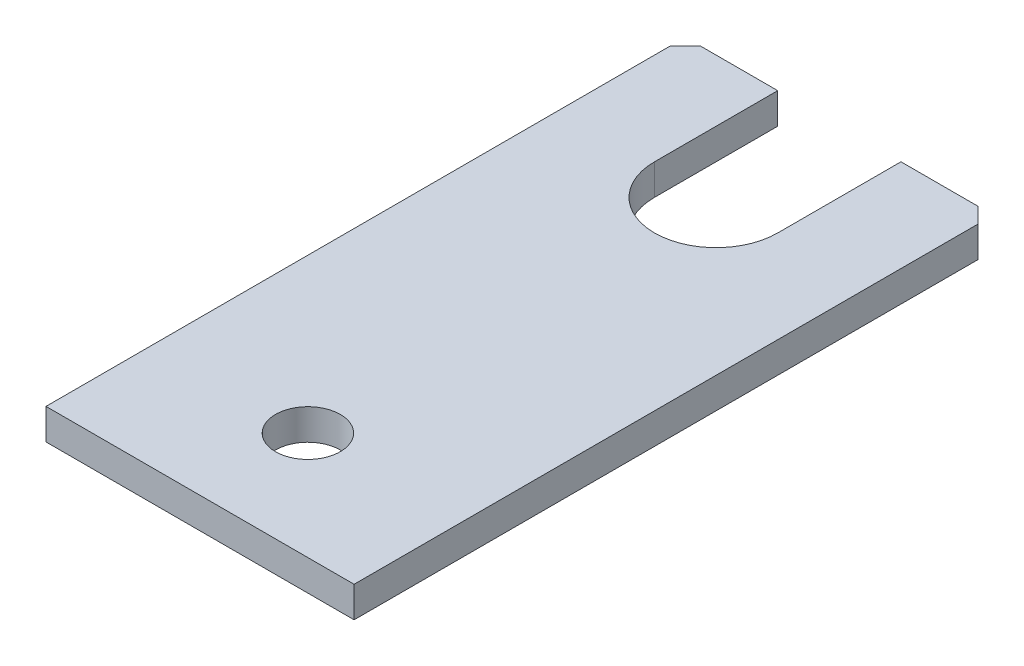
ISO-10303-21;
HEADER;
FILE_DESCRIPTION(('STEP AP214'),'2;1');
FILE_NAME('part.step','',(''),(''),'','','');
FILE_SCHEMA(('AUTOMOTIVE_DESIGN { 1 0 10303 214 1 1 1 1 }'));
ENDSEC;
DATA;
#1=APPLICATION_CONTEXT('core data for automotive mechanical design processes');
#2=APPLICATION_PROTOCOL_DEFINITION('international standard','automotive_design',2000,#1);
#3=PRODUCT_CONTEXT('',#1,'mechanical');
#4=PRODUCT('Part','Part','',(#3));
#5=PRODUCT_RELATED_PRODUCT_CATEGORY('part','',(#4));
#6=PRODUCT_DEFINITION_FORMATION('','',#4);
#7=PRODUCT_DEFINITION_CONTEXT('part definition',#1,'design');
#8=PRODUCT_DEFINITION('design','',#6,#7);
#9=PRODUCT_DEFINITION_SHAPE('','',#8);
#10=(LENGTH_UNIT() NAMED_UNIT(*) SI_UNIT(.MILLI.,.METRE.));
#11=(NAMED_UNIT(*) PLANE_ANGLE_UNIT() SI_UNIT($,.RADIAN.));
#12=(NAMED_UNIT(*) SI_UNIT($,.STERADIAN.) SOLID_ANGLE_UNIT());
#13=UNCERTAINTY_MEASURE_WITH_UNIT(LENGTH_MEASURE(1.E-05),#10,'distance_accuracy_value','');
#14=(GEOMETRIC_REPRESENTATION_CONTEXT(3) GLOBAL_UNCERTAINTY_ASSIGNED_CONTEXT((#13)) GLOBAL_UNIT_ASSIGNED_CONTEXT((#10,
#11,#12)) REPRESENTATION_CONTEXT('',''));
#15=CARTESIAN_POINT('',(0.,0.,0.));
#16=DIRECTION('',(0.,0.,1.));
#17=DIRECTION('',(1.,0.,0.));
#18=AXIS2_PLACEMENT_3D('',#15,#16,#17);
#19=CARTESIAN_POINT('',(10.,2.,-33.5));
#20=DIRECTION('',(0.,1.,0.));
#21=DIRECTION('',(0.,0.,1.));
#22=AXIS2_PLACEMENT_3D('',#19,#20,#21);
#23=PLANE('',#22);
#24=CARTESIAN_POINT('',(10.,2.,-7.));
#25=DIRECTION('',(0.,1.,0.));
#26=DIRECTION('',(0.,0.,1.));
#27=AXIS2_PLACEMENT_3D('',#24,#25,#26);
#28=CIRCLE('',#27,2.09999999999999);
#29=CARTESIAN_POINT('',(10.,2.,-4.90000000000001));
#30=VERTEX_POINT('',#29);
#31=EDGE_CURVE('E211',#30,#30,#28,.T.);
#32=ORIENTED_EDGE('',*,*,#31,.F.);
#33=EDGE_LOOP('',(#32));
#34=FACE_BOUND('',#33,.T.);
#35=DIRECTION('',(0.,0.,1.));
#36=VECTOR('',#35,1.);
#37=CARTESIAN_POINT('',(0.,2.,-40.5));
#38=LINE('',#37,#36);
#39=CARTESIAN_POINT('',(0.,2.,-40.5));
#40=VERTEX_POINT('',#39);
#41=CARTESIAN_POINT('',(0.,2.,0.));
#42=VERTEX_POINT('',#41);
#43=EDGE_CURVE('E163',#40,#42,#38,.T.);
#44=ORIENTED_EDGE('',*,*,#43,.T.);
#45=DIRECTION('',(1.,0.,0.));
#46=VECTOR('',#45,1.);
#47=CARTESIAN_POINT('',(0.,2.,0.));
#48=LINE('',#47,#46);
#49=CARTESIAN_POINT('',(20.,2.,0.));
#50=VERTEX_POINT('',#49);
#51=EDGE_CURVE('E103',#42,#50,#48,.T.);
#52=ORIENTED_EDGE('',*,*,#51,.T.);
#53=DIRECTION('',(0.,0.,-1.));
#54=VECTOR('',#53,1.);
#55=CARTESIAN_POINT('',(20.,2.,0.));
#56=LINE('',#55,#54);
#57=CARTESIAN_POINT('',(20.,2.,-40.5));
#58=VERTEX_POINT('',#57);
#59=EDGE_CURVE('E185',#50,#58,#56,.T.);
#60=ORIENTED_EDGE('',*,*,#59,.T.);
#61=DIRECTION('',(-0.707106781186547,0.,-0.707106781186547));
#62=VECTOR('',#61,1.);
#63=CARTESIAN_POINT('',(20.,2.,-40.5));
#64=LINE('',#63,#62);
#65=CARTESIAN_POINT('',(19.,2.,-41.5));
#66=VERTEX_POINT('',#65);
#67=EDGE_CURVE('E203',#58,#66,#64,.T.);
#68=ORIENTED_EDGE('',*,*,#67,.T.);
#69=DIRECTION('',(-1.,0.,0.));
#70=VECTOR('',#69,1.);
#71=CARTESIAN_POINT('',(19.,2.,-41.5));
#72=LINE('',#71,#70);
#73=CARTESIAN_POINT('',(14.,2.,-41.5));
#74=VERTEX_POINT('',#73);
#75=EDGE_CURVE('E200',#66,#74,#72,.T.);
#76=ORIENTED_EDGE('',*,*,#75,.T.);
#77=DIRECTION('',(0.,0.,1.));
#78=VECTOR('',#77,1.);
#79=CARTESIAN_POINT('',(14.,2.,-33.5));
#80=LINE('',#79,#78);
#81=CARTESIAN_POINT('',(14.,2.,-33.5));
#82=VERTEX_POINT('',#81);
#83=EDGE_CURVE('E202',#74,#82,#80,.T.);
#84=ORIENTED_EDGE('',*,*,#83,.T.);
#85=CARTESIAN_POINT('',(10.,2.,-33.5));
#86=DIRECTION('',(0.,-1.,0.));
#87=DIRECTION('',(0.,0.,1.));
#88=AXIS2_PLACEMENT_3D('',#85,#86,#87);
#89=CIRCLE('',#88,4.);
#90=CARTESIAN_POINT('',(6.,2.,-33.5));
#91=VERTEX_POINT('',#90);
#92=EDGE_CURVE('E127',#82,#91,#89,.T.);
#93=ORIENTED_EDGE('',*,*,#92,.T.);
#94=DIRECTION('',(0.,0.,-1.));
#95=VECTOR('',#94,1.);
#96=CARTESIAN_POINT('',(6.,2.,-33.5));
#97=LINE('',#96,#95);
#98=CARTESIAN_POINT('',(6.,2.,-41.5));
#99=VERTEX_POINT('',#98);
#100=EDGE_CURVE('E122',#91,#99,#97,.T.);
#101=ORIENTED_EDGE('',*,*,#100,.T.);
#102=DIRECTION('',(-1.,0.,0.));
#103=VECTOR('',#102,1.);
#104=CARTESIAN_POINT('',(6.,2.,-41.5));
#105=LINE('',#104,#103);
#106=CARTESIAN_POINT('',(1.,2.,-41.5));
#107=VERTEX_POINT('',#106);
#108=EDGE_CURVE('E125',#99,#107,#105,.T.);
#109=ORIENTED_EDGE('',*,*,#108,.T.);
#110=DIRECTION('',(-0.707106781186547,0.,0.707106781186548));
#111=VECTOR('',#110,1.);
#112=CARTESIAN_POINT('',(1.,2.,-41.5));
#113=LINE('',#112,#111);
#114=EDGE_CURVE('E54',#107,#40,#113,.T.);
#115=ORIENTED_EDGE('',*,*,#114,.T.);
#116=EDGE_LOOP('',(#44,#52,#60,#68,#76,#84,#93,#101,#109,#115));
#117=FACE_BOUND('',#116,.T.);
#118=ADVANCED_FACE('F36',(#34,#117),#23,.T.);
#119=CARTESIAN_POINT('',(10.,0.,-33.5));
#120=DIRECTION('',(0.,1.,0.));
#121=DIRECTION('',(0.,0.,1.));
#122=AXIS2_PLACEMENT_3D('',#119,#120,#121);
#123=PLANE('',#122);
#124=CARTESIAN_POINT('',(10.,0.,-7.));
#125=DIRECTION('',(0.,1.,0.));
#126=DIRECTION('',(0.,0.,1.));
#127=AXIS2_PLACEMENT_3D('',#124,#125,#126);
#128=CIRCLE('',#127,2.09999999999999);
#129=CARTESIAN_POINT('',(10.,0.,-4.90000000000001));
#130=VERTEX_POINT('',#129);
#131=EDGE_CURVE('E40',#130,#130,#128,.T.);
#132=ORIENTED_EDGE('',*,*,#131,.T.);
#133=EDGE_LOOP('',(#132));
#134=FACE_BOUND('',#133,.T.);
#135=DIRECTION('',(0.,0.,1.));
#136=VECTOR('',#135,1.);
#137=CARTESIAN_POINT('',(0.,0.,-40.5));
#138=LINE('',#137,#136);
#139=CARTESIAN_POINT('',(0.,0.,-40.5));
#140=VERTEX_POINT('',#139);
#141=CARTESIAN_POINT('',(0.,0.,0.));
#142=VERTEX_POINT('',#141);
#143=EDGE_CURVE('E145',#140,#142,#138,.T.);
#144=ORIENTED_EDGE('',*,*,#143,.F.);
#145=DIRECTION('',(-0.707106781186547,0.,0.707106781186548));
#146=VECTOR('',#145,1.);
#147=CARTESIAN_POINT('',(1.,0.,-41.5));
#148=LINE('',#147,#146);
#149=CARTESIAN_POINT('',(1.,0.,-41.5));
#150=VERTEX_POINT('',#149);
#151=EDGE_CURVE('E95',#150,#140,#148,.T.);
#152=ORIENTED_EDGE('',*,*,#151,.F.);
#153=DIRECTION('',(-1.,0.,0.));
#154=VECTOR('',#153,1.);
#155=CARTESIAN_POINT('',(6.,0.,-41.5));
#156=LINE('',#155,#154);
#157=CARTESIAN_POINT('',(6.,0.,-41.5));
#158=VERTEX_POINT('',#157);
#159=EDGE_CURVE('E89',#158,#150,#156,.T.);
#160=ORIENTED_EDGE('',*,*,#159,.F.);
#161=DIRECTION('',(0.,0.,-1.));
#162=VECTOR('',#161,1.);
#163=CARTESIAN_POINT('',(6.,0.,-33.5));
#164=LINE('',#163,#162);
#165=CARTESIAN_POINT('',(6.,0.,-33.5));
#166=VERTEX_POINT('',#165);
#167=EDGE_CURVE('E135',#166,#158,#164,.T.);
#168=ORIENTED_EDGE('',*,*,#167,.F.);
#169=CARTESIAN_POINT('',(10.,0.,-33.5));
#170=DIRECTION('',(0.,-1.,0.));
#171=DIRECTION('',(0.,0.,1.));
#172=AXIS2_PLACEMENT_3D('',#169,#170,#171);
#173=CIRCLE('',#172,4.);
#174=CARTESIAN_POINT('',(14.,0.,-33.5));
#175=VERTEX_POINT('',#174);
#176=EDGE_CURVE('E158',#175,#166,#173,.T.);
#177=ORIENTED_EDGE('',*,*,#176,.F.);
#178=DIRECTION('',(0.,0.,1.));
#179=VECTOR('',#178,1.);
#180=CARTESIAN_POINT('',(14.,0.,-33.5));
#181=LINE('',#180,#179);
#182=CARTESIAN_POINT('',(14.,0.,-41.5));
#183=VERTEX_POINT('',#182);
#184=EDGE_CURVE('E156',#183,#175,#181,.T.);
#185=ORIENTED_EDGE('',*,*,#184,.F.);
#186=DIRECTION('',(-1.,0.,0.));
#187=VECTOR('',#186,1.);
#188=CARTESIAN_POINT('',(19.,0.,-41.5));
#189=LINE('',#188,#187);
#190=CARTESIAN_POINT('',(19.,0.,-41.5));
#191=VERTEX_POINT('',#190);
#192=EDGE_CURVE('E154',#191,#183,#189,.T.);
#193=ORIENTED_EDGE('',*,*,#192,.F.);
#194=DIRECTION('',(-0.707106781186547,0.,-0.707106781186547));
#195=VECTOR('',#194,1.);
#196=CARTESIAN_POINT('',(20.,0.,-40.5));
#197=LINE('',#196,#195);
#198=CARTESIAN_POINT('',(20.,0.,-40.5));
#199=VERTEX_POINT('',#198);
#200=EDGE_CURVE('E152',#199,#191,#197,.T.);
#201=ORIENTED_EDGE('',*,*,#200,.F.);
#202=DIRECTION('',(0.,0.,-1.));
#203=VECTOR('',#202,1.);
#204=CARTESIAN_POINT('',(20.,0.,0.));
#205=LINE('',#204,#203);
#206=CARTESIAN_POINT('',(20.,0.,0.));
#207=VERTEX_POINT('',#206);
#208=EDGE_CURVE('E150',#207,#199,#205,.T.);
#209=ORIENTED_EDGE('',*,*,#208,.F.);
#210=DIRECTION('',(1.,0.,0.));
#211=VECTOR('',#210,1.);
#212=CARTESIAN_POINT('',(0.,0.,0.));
#213=LINE('',#212,#211);
#214=EDGE_CURVE('E148',#142,#207,#213,.T.);
#215=ORIENTED_EDGE('',*,*,#214,.F.);
#216=EDGE_LOOP('',(#144,#152,#160,#168,#177,#185,#193,#201,#209,#215));
#217=FACE_BOUND('',#216,.T.);
#218=ADVANCED_FACE('F189',(#134,#217),#123,.F.);
#219=CARTESIAN_POINT('',(0.,2.,-40.5));
#220=DIRECTION('',(1.,0.,0.));
#221=DIRECTION('',(0.,0.,-1.));
#222=AXIS2_PLACEMENT_3D('',#219,#220,#221);
#223=PLANE('',#222);
#224=ORIENTED_EDGE('',*,*,#143,.T.);
#225=DIRECTION('',(0.,-1.,0.));
#226=VECTOR('',#225,1.);
#227=CARTESIAN_POINT('',(0.,2.,0.));
#228=LINE('',#227,#226);
#229=EDGE_CURVE('E11',#42,#142,#228,.T.);
#230=ORIENTED_EDGE('',*,*,#229,.F.);
#231=ORIENTED_EDGE('',*,*,#43,.F.);
#232=DIRECTION('',(0.,-1.,0.));
#233=VECTOR('',#232,1.);
#234=CARTESIAN_POINT('',(0.,2.,-40.5));
#235=LINE('',#234,#233);
#236=EDGE_CURVE('E141',#40,#140,#235,.T.);
#237=ORIENTED_EDGE('',*,*,#236,.T.);
#238=EDGE_LOOP('',(#224,#230,#231,#237));
#239=FACE_BOUND('',#238,.T.);
#240=ADVANCED_FACE('F38',(#239),#223,.F.);
#241=CARTESIAN_POINT('',(0.,2.,0.));
#242=DIRECTION('',(0.,0.,-1.));
#243=DIRECTION('',(-1.,0.,0.));
#244=AXIS2_PLACEMENT_3D('',#241,#242,#243);
#245=PLANE('',#244);
#246=ORIENTED_EDGE('',*,*,#214,.T.);
#247=DIRECTION('',(0.,-1.,0.));
#248=VECTOR('',#247,1.);
#249=CARTESIAN_POINT('',(20.,2.,0.));
#250=LINE('',#249,#248);
#251=EDGE_CURVE('E46',#50,#207,#250,.T.);
#252=ORIENTED_EDGE('',*,*,#251,.F.);
#253=ORIENTED_EDGE('',*,*,#51,.F.);
#254=ORIENTED_EDGE('',*,*,#229,.T.);
#255=EDGE_LOOP('',(#246,#252,#253,#254));
#256=FACE_BOUND('',#255,.T.);
#257=ADVANCED_FACE('F252',(#256),#245,.F.);
#258=CARTESIAN_POINT('',(20.,2.,0.));
#259=DIRECTION('',(-1.,0.,0.));
#260=DIRECTION('',(0.,0.,1.));
#261=AXIS2_PLACEMENT_3D('',#258,#259,#260);
#262=PLANE('',#261);
#263=ORIENTED_EDGE('',*,*,#208,.T.);
#264=DIRECTION('',(0.,-1.,0.));
#265=VECTOR('',#264,1.);
#266=CARTESIAN_POINT('',(20.,2.,-40.5));
#267=LINE('',#266,#265);
#268=EDGE_CURVE('E176',#58,#199,#267,.T.);
#269=ORIENTED_EDGE('',*,*,#268,.F.);
#270=ORIENTED_EDGE('',*,*,#59,.F.);
#271=ORIENTED_EDGE('',*,*,#251,.T.);
#272=EDGE_LOOP('',(#263,#269,#270,#271));
#273=FACE_BOUND('',#272,.T.);
#274=ADVANCED_FACE('F183',(#273),#262,.F.);
#275=CARTESIAN_POINT('',(20.,2.,-40.5));
#276=DIRECTION('',(-0.707106781186547,0.,0.707106781186547));
#277=DIRECTION('',(0.707106781186548,0.,0.707106781186548));
#278=AXIS2_PLACEMENT_3D('',#275,#276,#277);
#279=PLANE('',#278);
#280=ORIENTED_EDGE('',*,*,#200,.T.);
#281=DIRECTION('',(0.,-1.,0.));
#282=VECTOR('',#281,1.);
#283=CARTESIAN_POINT('',(19.,2.,-41.5));
#284=LINE('',#283,#282);
#285=EDGE_CURVE('E173',#66,#191,#284,.T.);
#286=ORIENTED_EDGE('',*,*,#285,.F.);
#287=ORIENTED_EDGE('',*,*,#67,.F.);
#288=ORIENTED_EDGE('',*,*,#268,.T.);
#289=EDGE_LOOP('',(#280,#286,#287,#288));
#290=FACE_BOUND('',#289,.T.);
#291=ADVANCED_FACE('F194',(#290),#279,.F.);
#292=CARTESIAN_POINT('',(19.,2.,-41.5));
#293=DIRECTION('',(0.,0.,1.));
#294=DIRECTION('',(1.,0.,0.));
#295=AXIS2_PLACEMENT_3D('',#292,#293,#294);
#296=PLANE('',#295);
#297=ORIENTED_EDGE('',*,*,#192,.T.);
#298=DIRECTION('',(0.,-1.,0.));
#299=VECTOR('',#298,1.);
#300=CARTESIAN_POINT('',(14.,2.,-41.5));
#301=LINE('',#300,#299);
#302=EDGE_CURVE('E170',#74,#183,#301,.T.);
#303=ORIENTED_EDGE('',*,*,#302,.F.);
#304=ORIENTED_EDGE('',*,*,#75,.F.);
#305=ORIENTED_EDGE('',*,*,#285,.T.);
#306=EDGE_LOOP('',(#297,#303,#304,#305));
#307=FACE_BOUND('',#306,.T.);
#308=ADVANCED_FACE('F198',(#307),#296,.F.);
#309=CARTESIAN_POINT('',(14.,2.,-33.5));
#310=DIRECTION('',(1.,0.,0.));
#311=DIRECTION('',(0.,0.,-1.));
#312=AXIS2_PLACEMENT_3D('',#309,#310,#311);
#313=PLANE('',#312);
#314=ORIENTED_EDGE('',*,*,#184,.T.);
#315=DIRECTION('',(0.,-1.,0.));
#316=VECTOR('',#315,1.);
#317=CARTESIAN_POINT('',(14.,2.,-33.5));
#318=LINE('',#317,#316);
#319=EDGE_CURVE('E167',#82,#175,#318,.T.);
#320=ORIENTED_EDGE('',*,*,#319,.F.);
#321=ORIENTED_EDGE('',*,*,#83,.F.);
#322=ORIENTED_EDGE('',*,*,#302,.T.);
#323=EDGE_LOOP('',(#314,#320,#321,#322));
#324=FACE_BOUND('',#323,.T.);
#325=ADVANCED_FACE('F242',(#324),#313,.F.);
#326=CARTESIAN_POINT('',(10.,2.,-33.5));
#327=DIRECTION('',(0.,-1.,0.));
#328=DIRECTION('',(0.,0.,-1.));
#329=AXIS2_PLACEMENT_3D('',#326,#327,#328);
#330=CYLINDRICAL_SURFACE('',#329,4.);
#331=ORIENTED_EDGE('',*,*,#176,.T.);
#332=DIRECTION('',(0.,-1.,0.));
#333=VECTOR('',#332,1.);
#334=CARTESIAN_POINT('',(6.,2.,-33.5));
#335=LINE('',#334,#333);
#336=EDGE_CURVE('E136',#91,#166,#335,.T.);
#337=ORIENTED_EDGE('',*,*,#336,.F.);
#338=ORIENTED_EDGE('',*,*,#92,.F.);
#339=ORIENTED_EDGE('',*,*,#319,.T.);
#340=EDGE_LOOP('',(#331,#337,#338,#339));
#341=FACE_BOUND('',#340,.T.);
#342=ADVANCED_FACE('F239',(#341),#330,.F.);
#343=CARTESIAN_POINT('',(6.,2.,-33.5));
#344=DIRECTION('',(-1.,0.,0.));
#345=DIRECTION('',(0.,0.,1.));
#346=AXIS2_PLACEMENT_3D('',#343,#344,#345);
#347=PLANE('',#346);
#348=ORIENTED_EDGE('',*,*,#167,.T.);
#349=DIRECTION('',(0.,-1.,0.));
#350=VECTOR('',#349,1.);
#351=CARTESIAN_POINT('',(6.,2.,-41.5));
#352=LINE('',#351,#350);
#353=EDGE_CURVE('E132',#99,#158,#352,.T.);
#354=ORIENTED_EDGE('',*,*,#353,.F.);
#355=ORIENTED_EDGE('',*,*,#100,.F.);
#356=ORIENTED_EDGE('',*,*,#336,.T.);
#357=EDGE_LOOP('',(#348,#354,#355,#356));
#358=FACE_BOUND('',#357,.T.);
#359=ADVANCED_FACE('F133',(#358),#347,.F.);
#360=CARTESIAN_POINT('',(6.,2.,-41.5));
#361=DIRECTION('',(0.,0.,1.));
#362=DIRECTION('',(1.,0.,0.));
#363=AXIS2_PLACEMENT_3D('',#360,#361,#362);
#364=PLANE('',#363);
#365=ORIENTED_EDGE('',*,*,#159,.T.);
#366=DIRECTION('',(0.,-1.,0.));
#367=VECTOR('',#366,1.);
#368=CARTESIAN_POINT('',(1.,2.,-41.5));
#369=LINE('',#368,#367);
#370=EDGE_CURVE('E137',#107,#150,#369,.T.);
#371=ORIENTED_EDGE('',*,*,#370,.F.);
#372=ORIENTED_EDGE('',*,*,#108,.F.);
#373=ORIENTED_EDGE('',*,*,#353,.T.);
#374=EDGE_LOOP('',(#365,#371,#372,#373));
#375=FACE_BOUND('',#374,.T.);
#376=ADVANCED_FACE('F139',(#375),#364,.F.);
#377=CARTESIAN_POINT('',(1.,2.,-41.5));
#378=DIRECTION('',(0.707106781186548,0.,0.707106781186547));
#379=DIRECTION('',(0.707106781186547,0.,-0.707106781186548));
#380=AXIS2_PLACEMENT_3D('',#377,#378,#379);
#381=PLANE('',#380);
#382=ORIENTED_EDGE('',*,*,#151,.T.);
#383=ORIENTED_EDGE('',*,*,#236,.F.);
#384=ORIENTED_EDGE('',*,*,#114,.F.);
#385=ORIENTED_EDGE('',*,*,#370,.T.);
#386=EDGE_LOOP('',(#382,#383,#384,#385));
#387=FACE_BOUND('',#386,.T.);
#388=ADVANCED_FACE('F221',(#387),#381,.F.);
#389=CARTESIAN_POINT('',(10.,2.,-7.));
#390=DIRECTION('',(0.,1.,0.));
#391=DIRECTION('',(0.,0.,1.));
#392=AXIS2_PLACEMENT_3D('',#389,#390,#391);
#393=CYLINDRICAL_SURFACE('',#392,2.09999999999999);
#394=ORIENTED_EDGE('',*,*,#31,.T.);
#395=EDGE_LOOP('',(#394));
#396=FACE_BOUND('',#395,.T.);
#397=ORIENTED_EDGE('',*,*,#131,.F.);
#398=EDGE_LOOP('',(#397));
#399=FACE_BOUND('',#398,.T.);
#400=ADVANCED_FACE('F219',(#396,#399),#393,.F.);
#401=CLOSED_SHELL('',(#118,#218,#240,#257,#274,#291,#308,#325,#342,#359,#376,#388,#400));
#402=MANIFOLD_SOLID_BREP('B2',#401);
#403=ADVANCED_BREP_SHAPE_REPRESENTATION('',(#18,#402),#14);
#404=SHAPE_DEFINITION_REPRESENTATION(#9,#403);
ENDSEC;
END-ISO-10303-21;
